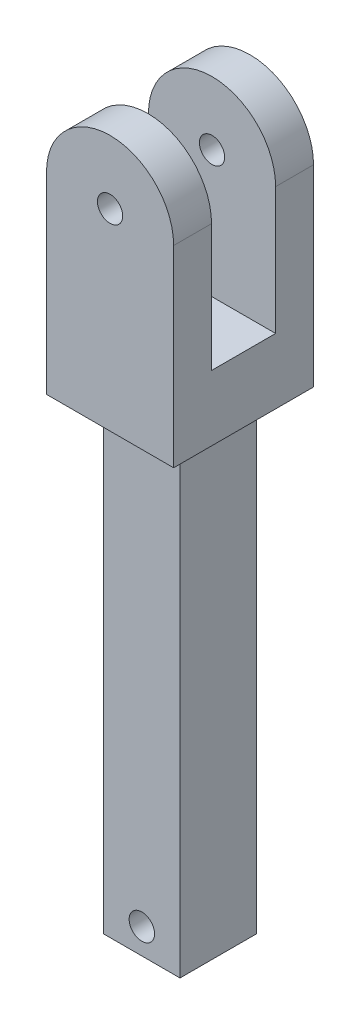
ISO-10303-21;
HEADER;
FILE_DESCRIPTION(('STEP AP214'),'2;1');
FILE_NAME('part.step','',(''),(''),'','','');
FILE_SCHEMA(('AUTOMOTIVE_DESIGN { 1 0 10303 214 1 1 1 1 }'));
ENDSEC;
DATA;
#1=APPLICATION_CONTEXT('core data for automotive mechanical design processes');
#2=APPLICATION_PROTOCOL_DEFINITION('international standard','automotive_design',2000,#1);
#3=PRODUCT_CONTEXT('',#1,'mechanical');
#4=PRODUCT('Part','Part','',(#3));
#5=PRODUCT_RELATED_PRODUCT_CATEGORY('part','',(#4));
#6=PRODUCT_DEFINITION_FORMATION('','',#4);
#7=PRODUCT_DEFINITION_CONTEXT('part definition',#1,'design');
#8=PRODUCT_DEFINITION('design','',#6,#7);
#9=PRODUCT_DEFINITION_SHAPE('','',#8);
#10=(LENGTH_UNIT() NAMED_UNIT(*) SI_UNIT(.MILLI.,.METRE.));
#11=(NAMED_UNIT(*) PLANE_ANGLE_UNIT() SI_UNIT($,.RADIAN.));
#12=(NAMED_UNIT(*) SI_UNIT($,.STERADIAN.) SOLID_ANGLE_UNIT());
#13=UNCERTAINTY_MEASURE_WITH_UNIT(LENGTH_MEASURE(1.E-05),#10,'distance_accuracy_value','');
#14=(GEOMETRIC_REPRESENTATION_CONTEXT(3) GLOBAL_UNCERTAINTY_ASSIGNED_CONTEXT((#13)) GLOBAL_UNIT_ASSIGNED_CONTEXT((#10,
#11,#12)) REPRESENTATION_CONTEXT('',''));
#15=CARTESIAN_POINT('',(0.,0.,0.));
#16=DIRECTION('',(0.,0.,1.));
#17=DIRECTION('',(1.,0.,0.));
#18=AXIS2_PLACEMENT_3D('',#15,#16,#17);
#19=CARTESIAN_POINT('',(10.,0.,12.));
#20=DIRECTION('',(-1.,0.,0.));
#21=DIRECTION('',(0.,-1.,0.));
#22=AXIS2_PLACEMENT_3D('',#19,#20,#21);
#23=PLANE('',#22);
#24=DIRECTION('',(0.,0.,-1.));
#25=VECTOR('',#24,1.);
#26=CARTESIAN_POINT('',(10.,-20.,0.));
#27=LINE('',#26,#25);
#28=CARTESIAN_POINT('',(10.,-20.,11.04));
#29=VERTEX_POINT('',#28);
#30=CARTESIAN_POINT('',(10.,-20.,0.959999999999997));
#31=VERTEX_POINT('',#30);
#32=EDGE_CURVE('E225',#29,#31,#27,.T.);
#33=ORIENTED_EDGE('',*,*,#32,.F.);
#34=DIRECTION('',(0.,1.,0.));
#35=VECTOR('',#34,1.);
#36=CARTESIAN_POINT('',(10.,0.,11.04));
#37=LINE('',#36,#35);
#38=CARTESIAN_POINT('',(10.,0.,11.04));
#39=VERTEX_POINT('',#38);
#40=EDGE_CURVE('E175',#29,#39,#37,.T.);
#41=ORIENTED_EDGE('',*,*,#40,.T.);
#42=DIRECTION('',(0.,0.,-1.));
#43=VECTOR('',#42,1.);
#44=CARTESIAN_POINT('',(10.,0.,12.));
#45=LINE('',#44,#43);
#46=CARTESIAN_POINT('',(10.,0.,17.));
#47=VERTEX_POINT('',#46);
#48=EDGE_CURVE('E11',#47,#39,#45,.T.);
#49=ORIENTED_EDGE('',*,*,#48,.F.);
#50=DIRECTION('',(0.,1.,0.));
#51=VECTOR('',#50,1.);
#52=CARTESIAN_POINT('',(10.,0.,17.));
#53=LINE('',#52,#51);
#54=CARTESIAN_POINT('',(10.,-30.2764175480678,17.));
#55=VERTEX_POINT('',#54);
#56=EDGE_CURVE('E222',#55,#47,#53,.T.);
#57=ORIENTED_EDGE('',*,*,#56,.F.);
#58=DIRECTION('',(0.,0.,-1.));
#59=VECTOR('',#58,1.);
#60=CARTESIAN_POINT('',(10.,-30.2764175480678,12.));
#61=LINE('',#60,#59);
#62=CARTESIAN_POINT('',(10.,-30.2764175480678,-5.));
#63=VERTEX_POINT('',#62);
#64=EDGE_CURVE('E228',#55,#63,#61,.T.);
#65=ORIENTED_EDGE('',*,*,#64,.T.);
#66=DIRECTION('',(0.,-1.,0.));
#67=VECTOR('',#66,1.);
#68=CARTESIAN_POINT('',(10.,0.,-5.));
#69=LINE('',#68,#67);
#70=CARTESIAN_POINT('',(10.,0.,-5.));
#71=VERTEX_POINT('',#70);
#72=EDGE_CURVE('E201',#71,#63,#69,.T.);
#73=ORIENTED_EDGE('',*,*,#72,.F.);
#74=CARTESIAN_POINT('',(10.,0.,0.959999999999997));
#75=VERTEX_POINT('',#74);
#76=EDGE_CURVE('E52',#75,#71,#45,.T.);
#77=ORIENTED_EDGE('',*,*,#76,.F.);
#78=DIRECTION('',(0.,1.,0.));
#79=VECTOR('',#78,1.);
#80=CARTESIAN_POINT('',(10.,0.,0.959999999999997));
#81=LINE('',#80,#79);
#82=EDGE_CURVE('E173',#31,#75,#81,.T.);
#83=ORIENTED_EDGE('',*,*,#82,.F.);
#84=EDGE_LOOP('',(#33,#41,#49,#57,#65,#73,#77,#83));
#85=FACE_BOUND('',#84,.T.);
#86=ADVANCED_FACE('F43',(#85),#23,.F.);
#87=CARTESIAN_POINT('',(0.,0.,12.));
#88=DIRECTION('',(0.,0.,-1.));
#89=DIRECTION('',(-1.,0.,0.));
#90=AXIS2_PLACEMENT_3D('',#87,#88,#89);
#91=CYLINDRICAL_SURFACE('',#90,10.);
#92=CARTESIAN_POINT('',(0.,0.,0.959999999999997));
#93=DIRECTION('',(0.,0.,1.));
#94=DIRECTION('',(1.,0.,0.));
#95=AXIS2_PLACEMENT_3D('',#92,#93,#94);
#96=CIRCLE('',#95,10.);
#97=CARTESIAN_POINT('',(-10.,0.,0.959999999999997));
#98=VERTEX_POINT('',#97);
#99=EDGE_CURVE('E193',#75,#98,#96,.T.);
#100=ORIENTED_EDGE('',*,*,#99,.F.);
#101=ORIENTED_EDGE('',*,*,#76,.T.);
#102=CARTESIAN_POINT('',(0.,0.,-5.));
#103=DIRECTION('',(0.,0.,-1.));
#104=DIRECTION('',(-1.,0.,0.));
#105=AXIS2_PLACEMENT_3D('',#102,#103,#104);
#106=CIRCLE('',#105,10.);
#107=CARTESIAN_POINT('',(-10.,0.,-5.));
#108=VERTEX_POINT('',#107);
#109=EDGE_CURVE('E198',#108,#71,#106,.T.);
#110=ORIENTED_EDGE('',*,*,#109,.F.);
#111=DIRECTION('',(0.,0.,-1.));
#112=VECTOR('',#111,1.);
#113=CARTESIAN_POINT('',(-10.,0.,12.));
#114=LINE('',#113,#112);
#115=EDGE_CURVE('E233',#98,#108,#114,.T.);
#116=ORIENTED_EDGE('',*,*,#115,.F.);
#117=EDGE_LOOP('',(#100,#101,#110,#116));
#118=FACE_BOUND('',#117,.T.);
#119=ADVANCED_FACE('F260',(#118),#91,.T.);
#120=CARTESIAN_POINT('',(-10.,0.,12.));
#121=DIRECTION('',(1.,0.,0.));
#122=DIRECTION('',(0.,1.,0.));
#123=AXIS2_PLACEMENT_3D('',#120,#121,#122);
#124=PLANE('',#123);
#125=DIRECTION('',(0.,1.,0.));
#126=VECTOR('',#125,1.);
#127=CARTESIAN_POINT('',(-10.,0.,0.959999999999997));
#128=LINE('',#127,#126);
#129=CARTESIAN_POINT('',(-10.,-20.,0.959999999999997));
#130=VERTEX_POINT('',#129);
#131=EDGE_CURVE('E141',#130,#98,#128,.T.);
#132=ORIENTED_EDGE('',*,*,#131,.T.);
#133=ORIENTED_EDGE('',*,*,#115,.T.);
#134=DIRECTION('',(0.,1.,0.));
#135=VECTOR('',#134,1.);
#136=CARTESIAN_POINT('',(-10.,0.,-5.));
#137=LINE('',#136,#135);
#138=CARTESIAN_POINT('',(-10.,-30.2764175480678,-5.));
#139=VERTEX_POINT('',#138);
#140=EDGE_CURVE('E207',#139,#108,#137,.T.);
#141=ORIENTED_EDGE('',*,*,#140,.F.);
#142=DIRECTION('',(0.,0.,-1.));
#143=VECTOR('',#142,1.);
#144=CARTESIAN_POINT('',(-10.,-30.2764175480678,12.));
#145=LINE('',#144,#143);
#146=CARTESIAN_POINT('',(-10.,-30.2764175480678,17.));
#147=VERTEX_POINT('',#146);
#148=EDGE_CURVE('E231',#147,#139,#145,.T.);
#149=ORIENTED_EDGE('',*,*,#148,.F.);
#150=DIRECTION('',(0.,-1.,0.));
#151=VECTOR('',#150,1.);
#152=CARTESIAN_POINT('',(-10.,0.,17.));
#153=LINE('',#152,#151);
#154=CARTESIAN_POINT('',(-10.,0.,17.));
#155=VERTEX_POINT('',#154);
#156=EDGE_CURVE('E216',#155,#147,#153,.T.);
#157=ORIENTED_EDGE('',*,*,#156,.F.);
#158=CARTESIAN_POINT('',(-10.,0.,11.04));
#159=VERTEX_POINT('',#158);
#160=EDGE_CURVE('E234',#155,#159,#114,.T.);
#161=ORIENTED_EDGE('',*,*,#160,.T.);
#162=DIRECTION('',(0.,1.,0.));
#163=VECTOR('',#162,1.);
#164=CARTESIAN_POINT('',(-10.,0.,11.04));
#165=LINE('',#164,#163);
#166=CARTESIAN_POINT('',(-10.,-20.,11.04));
#167=VERTEX_POINT('',#166);
#168=EDGE_CURVE('E176',#167,#159,#165,.T.);
#169=ORIENTED_EDGE('',*,*,#168,.F.);
#170=DIRECTION('',(0.,0.,-1.));
#171=VECTOR('',#170,1.);
#172=CARTESIAN_POINT('',(-10.,-20.,0.));
#173=LINE('',#172,#171);
#174=EDGE_CURVE('E226',#167,#130,#173,.T.);
#175=ORIENTED_EDGE('',*,*,#174,.T.);
#176=EDGE_LOOP('',(#132,#133,#141,#149,#157,#161,#169,#175));
#177=FACE_BOUND('',#176,.T.);
#178=ADVANCED_FACE('F256',(#177),#124,.F.);
#179=CARTESIAN_POINT('',(0.,0.,12.));
#180=DIRECTION('',(0.,0.,-1.));
#181=DIRECTION('',(-1.,0.,0.));
#182=AXIS2_PLACEMENT_3D('',#179,#180,#181);
#183=CYLINDRICAL_SURFACE('',#182,1.985);
#184=CARTESIAN_POINT('',(0.,0.,-5.));
#185=DIRECTION('',(0.,0.,-1.));
#186=DIRECTION('',(-1.,0.,0.));
#187=AXIS2_PLACEMENT_3D('',#184,#185,#186);
#188=CIRCLE('',#187,1.985);
#189=CARTESIAN_POINT('',(-1.985,0.,-5.));
#190=VERTEX_POINT('',#189);
#191=EDGE_CURVE('E195',#190,#190,#188,.F.);
#192=ORIENTED_EDGE('',*,*,#191,.F.);
#193=EDGE_LOOP('',(#192));
#194=FACE_BOUND('',#193,.T.);
#195=CARTESIAN_POINT('',(0.,0.,0.959999999999997));
#196=DIRECTION('',(0.,0.,1.));
#197=DIRECTION('',(1.,0.,0.));
#198=AXIS2_PLACEMENT_3D('',#195,#196,#197);
#199=CIRCLE('',#198,1.985);
#200=CARTESIAN_POINT('',(1.985,0.,0.959999999999997));
#201=VERTEX_POINT('',#200);
#202=EDGE_CURVE('E192',#201,#201,#199,.T.);
#203=ORIENTED_EDGE('',*,*,#202,.T.);
#204=EDGE_LOOP('',(#203));
#205=FACE_BOUND('',#204,.T.);
#206=ADVANCED_FACE('F241',(#194,#205),#183,.F.);
#207=ORIENTED_EDGE('',*,*,#48,.T.);
#208=CARTESIAN_POINT('',(0.,0.,11.04));
#209=DIRECTION('',(0.,0.,1.));
#210=DIRECTION('',(1.,0.,0.));
#211=AXIS2_PLACEMENT_3D('',#208,#209,#210);
#212=CIRCLE('',#211,10.);
#213=EDGE_CURVE('E190',#39,#159,#212,.T.);
#214=ORIENTED_EDGE('',*,*,#213,.T.);
#215=ORIENTED_EDGE('',*,*,#160,.F.);
#216=CARTESIAN_POINT('',(0.,0.,17.));
#217=DIRECTION('',(0.,0.,1.));
#218=DIRECTION('',(1.,0.,0.));
#219=AXIS2_PLACEMENT_3D('',#216,#217,#218);
#220=CIRCLE('',#219,10.);
#221=EDGE_CURVE('E213',#47,#155,#220,.T.);
#222=ORIENTED_EDGE('',*,*,#221,.F.);
#223=EDGE_LOOP('',(#207,#214,#215,#222));
#224=FACE_BOUND('',#223,.T.);
#225=ADVANCED_FACE('F275',(#224),#91,.T.);
#226=CARTESIAN_POINT('',(0.,0.,11.04));
#227=DIRECTION('',(0.,0.,1.));
#228=DIRECTION('',(1.,0.,0.));
#229=AXIS2_PLACEMENT_3D('',#226,#227,#228);
#230=CIRCLE('',#229,1.985);
#231=CARTESIAN_POINT('',(1.985,0.,11.04));
#232=VERTEX_POINT('',#231);
#233=EDGE_CURVE('E187',#232,#232,#230,.T.);
#234=ORIENTED_EDGE('',*,*,#233,.F.);
#235=EDGE_LOOP('',(#234));
#236=FACE_BOUND('',#235,.T.);
#237=CARTESIAN_POINT('',(0.,0.,17.));
#238=DIRECTION('',(0.,0.,1.));
#239=DIRECTION('',(1.,0.,0.));
#240=AXIS2_PLACEMENT_3D('',#237,#238,#239);
#241=CIRCLE('',#240,1.985);
#242=CARTESIAN_POINT('',(1.985,0.,17.));
#243=VERTEX_POINT('',#242);
#244=EDGE_CURVE('E210',#243,#243,#241,.F.);
#245=ORIENTED_EDGE('',*,*,#244,.F.);
#246=EDGE_LOOP('',(#245));
#247=FACE_BOUND('',#246,.T.);
#248=ADVANCED_FACE('F45',(#236,#247),#183,.F.);
#249=CARTESIAN_POINT('',(0.,-30.2764175480678,12.));
#250=DIRECTION('',(0.,1.,0.));
#251=DIRECTION('',(0.,0.,1.));
#252=AXIS2_PLACEMENT_3D('',#249,#250,#251);
#253=PLANE('',#252);
#254=DIRECTION('',(1.,0.,0.));
#255=VECTOR('',#254,1.);
#256=CARTESIAN_POINT('',(0.,-30.2764175480678,0.));
#257=LINE('',#256,#255);
#258=CARTESIAN_POINT('',(-6.,-30.2764175480678,0.));
#259=VERTEX_POINT('',#258);
#260=CARTESIAN_POINT('',(6.,-30.2764175480678,0.));
#261=VERTEX_POINT('',#260);
#262=EDGE_CURVE('E165',#259,#261,#257,.T.);
#263=ORIENTED_EDGE('',*,*,#262,.F.);
#264=DIRECTION('',(0.,0.,1.));
#265=VECTOR('',#264,1.);
#266=CARTESIAN_POINT('',(-6.,-30.2764175480678,0.));
#267=LINE('',#266,#265);
#268=CARTESIAN_POINT('',(-6.,-30.2764175480678,12.));
#269=VERTEX_POINT('',#268);
#270=EDGE_CURVE('E60',#259,#269,#267,.T.);
#271=ORIENTED_EDGE('',*,*,#270,.T.);
#272=DIRECTION('',(1.,0.,0.));
#273=VECTOR('',#272,1.);
#274=CARTESIAN_POINT('',(0.,-30.2764175480678,12.));
#275=LINE('',#274,#273);
#276=CARTESIAN_POINT('',(6.,-30.2764175480678,12.));
#277=VERTEX_POINT('',#276);
#278=EDGE_CURVE('E65',#269,#277,#275,.T.);
#279=ORIENTED_EDGE('',*,*,#278,.T.);
#280=DIRECTION('',(0.,0.,1.));
#281=VECTOR('',#280,1.);
#282=CARTESIAN_POINT('',(6.,-30.2764175480678,0.));
#283=LINE('',#282,#281);
#284=EDGE_CURVE('E156',#261,#277,#283,.T.);
#285=ORIENTED_EDGE('',*,*,#284,.F.);
#286=EDGE_LOOP('',(#263,#271,#279,#285));
#287=FACE_BOUND('',#286,.T.);
#288=ORIENTED_EDGE('',*,*,#148,.T.);
#289=DIRECTION('',(-1.,0.,0.));
#290=VECTOR('',#289,1.);
#291=CARTESIAN_POINT('',(0.,-30.2764175480678,-5.));
#292=LINE('',#291,#290);
#293=EDGE_CURVE('E204',#63,#139,#292,.T.);
#294=ORIENTED_EDGE('',*,*,#293,.F.);
#295=ORIENTED_EDGE('',*,*,#64,.F.);
#296=DIRECTION('',(1.,0.,0.));
#297=VECTOR('',#296,1.);
#298=CARTESIAN_POINT('',(0.,-30.2764175480678,17.));
#299=LINE('',#298,#297);
#300=EDGE_CURVE('E219',#147,#55,#299,.T.);
#301=ORIENTED_EDGE('',*,*,#300,.F.);
#302=EDGE_LOOP('',(#288,#294,#295,#301));
#303=FACE_BOUND('',#302,.T.);
#304=ADVANCED_FACE('F272',(#287,#303),#253,.F.);
#305=CARTESIAN_POINT('',(-10.,-20.,0.));
#306=DIRECTION('',(0.,-1.,0.));
#307=DIRECTION('',(0.,0.,-1.));
#308=AXIS2_PLACEMENT_3D('',#305,#306,#307);
#309=PLANE('',#308);
#310=ORIENTED_EDGE('',*,*,#32,.T.);
#311=DIRECTION('',(-1.,0.,0.));
#312=VECTOR('',#311,1.);
#313=CARTESIAN_POINT('',(10.,-20.,0.959999999999997));
#314=LINE('',#313,#312);
#315=EDGE_CURVE('E179',#31,#130,#314,.T.);
#316=ORIENTED_EDGE('',*,*,#315,.T.);
#317=ORIENTED_EDGE('',*,*,#174,.F.);
#318=DIRECTION('',(-1.,0.,0.));
#319=VECTOR('',#318,1.);
#320=CARTESIAN_POINT('',(10.,-20.,11.04));
#321=LINE('',#320,#319);
#322=EDGE_CURVE('E184',#29,#167,#321,.T.);
#323=ORIENTED_EDGE('',*,*,#322,.F.);
#324=EDGE_LOOP('',(#310,#316,#317,#323));
#325=FACE_BOUND('',#324,.T.);
#326=ADVANCED_FACE('F280',(#325),#309,.F.);
#327=CARTESIAN_POINT('',(0.,0.,17.));
#328=DIRECTION('',(0.,0.,1.));
#329=DIRECTION('',(1.,0.,0.));
#330=AXIS2_PLACEMENT_3D('',#327,#328,#329);
#331=PLANE('',#330);
#332=ORIENTED_EDGE('',*,*,#244,.T.);
#333=EDGE_LOOP('',(#332));
#334=FACE_BOUND('',#333,.T.);
#335=ORIENTED_EDGE('',*,*,#221,.T.);
#336=ORIENTED_EDGE('',*,*,#156,.T.);
#337=ORIENTED_EDGE('',*,*,#300,.T.);
#338=ORIENTED_EDGE('',*,*,#56,.T.);
#339=EDGE_LOOP('',(#335,#336,#337,#338));
#340=FACE_BOUND('',#339,.T.);
#341=ADVANCED_FACE('F269',(#334,#340),#331,.T.);
#342=CARTESIAN_POINT('',(0.,0.,-5.));
#343=DIRECTION('',(0.,0.,-1.));
#344=DIRECTION('',(-1.,0.,0.));
#345=AXIS2_PLACEMENT_3D('',#342,#343,#344);
#346=PLANE('',#345);
#347=ORIENTED_EDGE('',*,*,#191,.T.);
#348=EDGE_LOOP('',(#347));
#349=FACE_BOUND('',#348,.T.);
#350=ORIENTED_EDGE('',*,*,#109,.T.);
#351=ORIENTED_EDGE('',*,*,#72,.T.);
#352=ORIENTED_EDGE('',*,*,#293,.T.);
#353=ORIENTED_EDGE('',*,*,#140,.T.);
#354=EDGE_LOOP('',(#350,#351,#352,#353));
#355=FACE_BOUND('',#354,.T.);
#356=ADVANCED_FACE('F263',(#349,#355),#346,.T.);
#357=CARTESIAN_POINT('',(10.,0.,11.04));
#358=DIRECTION('',(0.,0.,1.));
#359=DIRECTION('',(1.,0.,0.));
#360=AXIS2_PLACEMENT_3D('',#357,#358,#359);
#361=PLANE('',#360);
#362=ORIENTED_EDGE('',*,*,#233,.T.);
#363=EDGE_LOOP('',(#362));
#364=FACE_BOUND('',#363,.T.);
#365=ORIENTED_EDGE('',*,*,#40,.F.);
#366=ORIENTED_EDGE('',*,*,#322,.T.);
#367=ORIENTED_EDGE('',*,*,#168,.T.);
#368=ORIENTED_EDGE('',*,*,#213,.F.);
#369=EDGE_LOOP('',(#365,#366,#367,#368));
#370=FACE_BOUND('',#369,.T.);
#371=ADVANCED_FACE('F246',(#364,#370),#361,.F.);
#372=CARTESIAN_POINT('',(10.,0.,0.959999999999997));
#373=DIRECTION('',(0.,0.,1.));
#374=DIRECTION('',(1.,0.,0.));
#375=AXIS2_PLACEMENT_3D('',#372,#373,#374);
#376=PLANE('',#375);
#377=ORIENTED_EDGE('',*,*,#202,.F.);
#378=EDGE_LOOP('',(#377));
#379=FACE_BOUND('',#378,.T.);
#380=ORIENTED_EDGE('',*,*,#99,.T.);
#381=ORIENTED_EDGE('',*,*,#131,.F.);
#382=ORIENTED_EDGE('',*,*,#315,.F.);
#383=ORIENTED_EDGE('',*,*,#82,.T.);
#384=EDGE_LOOP('',(#380,#381,#382,#383));
#385=FACE_BOUND('',#384,.T.);
#386=ADVANCED_FACE('F243',(#379,#385),#376,.T.);
#387=CARTESIAN_POINT('',(-6.,-104.276417548068,0.));
#388=DIRECTION('',(-1.,0.,0.));
#389=DIRECTION('',(0.,0.,1.));
#390=AXIS2_PLACEMENT_3D('',#387,#388,#389);
#391=PLANE('',#390);
#392=ORIENTED_EDGE('',*,*,#270,.F.);
#393=DIRECTION('',(0.,1.,0.));
#394=VECTOR('',#393,1.);
#395=CARTESIAN_POINT('',(-6.,-104.276417548068,0.));
#396=LINE('',#395,#394);
#397=CARTESIAN_POINT('',(-6.,-104.276417548068,0.));
#398=VERTEX_POINT('',#397);
#399=EDGE_CURVE('E133',#398,#259,#396,.T.);
#400=ORIENTED_EDGE('',*,*,#399,.F.);
#401=DIRECTION('',(0.,0.,1.));
#402=VECTOR('',#401,1.);
#403=CARTESIAN_POINT('',(-6.,-104.276417548068,0.));
#404=LINE('',#403,#402);
#405=CARTESIAN_POINT('',(-6.,-104.276417548068,12.));
#406=VERTEX_POINT('',#405);
#407=EDGE_CURVE('E137',#398,#406,#404,.T.);
#408=ORIENTED_EDGE('',*,*,#407,.T.);
#409=DIRECTION('',(0.,1.,0.));
#410=VECTOR('',#409,1.);
#411=CARTESIAN_POINT('',(-6.,-104.276417548068,12.));
#412=LINE('',#411,#410);
#413=EDGE_CURVE('E163',#406,#269,#412,.T.);
#414=ORIENTED_EDGE('',*,*,#413,.T.);
#415=EDGE_LOOP('',(#392,#400,#408,#414));
#416=FACE_BOUND('',#415,.T.);
#417=ADVANCED_FACE('F135',(#416),#391,.T.);
#418=CARTESIAN_POINT('',(0.,-104.276417548068,0.));
#419=DIRECTION('',(0.,0.,1.));
#420=DIRECTION('',(1.,0.,0.));
#421=AXIS2_PLACEMENT_3D('',#418,#419,#420);
#422=PLANE('',#421);
#423=CARTESIAN_POINT('',(0.,-100.276417548068,0.));
#424=DIRECTION('',(0.,0.,-1.));
#425=DIRECTION('',(-1.,0.,0.));
#426=AXIS2_PLACEMENT_3D('',#423,#424,#425);
#427=CIRCLE('',#426,2.);
#428=CARTESIAN_POINT('',(-2.,-100.276417548068,0.));
#429=VERTEX_POINT('',#428);
#430=EDGE_CURVE('E159',#429,#429,#427,.T.);
#431=ORIENTED_EDGE('',*,*,#430,.F.);
#432=EDGE_LOOP('',(#431));
#433=FACE_BOUND('',#432,.T.);
#434=ORIENTED_EDGE('',*,*,#262,.T.);
#435=DIRECTION('',(0.,1.,0.));
#436=VECTOR('',#435,1.);
#437=CARTESIAN_POINT('',(6.,-104.276417548068,0.));
#438=LINE('',#437,#436);
#439=CARTESIAN_POINT('',(6.,-104.276417548068,0.));
#440=VERTEX_POINT('',#439);
#441=EDGE_CURVE('E142',#440,#261,#438,.T.);
#442=ORIENTED_EDGE('',*,*,#441,.F.);
#443=DIRECTION('',(1.,0.,0.));
#444=VECTOR('',#443,1.);
#445=CARTESIAN_POINT('',(0.,-104.276417548068,0.));
#446=LINE('',#445,#444);
#447=EDGE_CURVE('E145',#398,#440,#446,.T.);
#448=ORIENTED_EDGE('',*,*,#447,.F.);
#449=ORIENTED_EDGE('',*,*,#399,.T.);
#450=EDGE_LOOP('',(#434,#442,#448,#449));
#451=FACE_BOUND('',#450,.T.);
#452=ADVANCED_FACE('F146',(#433,#451),#422,.F.);
#453=CARTESIAN_POINT('',(6.,-104.276417548068,0.));
#454=DIRECTION('',(-1.,0.,0.));
#455=DIRECTION('',(0.,0.,1.));
#456=AXIS2_PLACEMENT_3D('',#453,#454,#455);
#457=PLANE('',#456);
#458=ORIENTED_EDGE('',*,*,#284,.T.);
#459=DIRECTION('',(0.,1.,0.));
#460=VECTOR('',#459,1.);
#461=CARTESIAN_POINT('',(6.,-104.276417548068,12.));
#462=LINE('',#461,#460);
#463=CARTESIAN_POINT('',(6.,-104.276417548068,12.));
#464=VERTEX_POINT('',#463);
#465=EDGE_CURVE('E170',#464,#277,#462,.T.);
#466=ORIENTED_EDGE('',*,*,#465,.F.);
#467=DIRECTION('',(0.,0.,1.));
#468=VECTOR('',#467,1.);
#469=CARTESIAN_POINT('',(6.,-104.276417548068,0.));
#470=LINE('',#469,#468);
#471=EDGE_CURVE('E150',#440,#464,#470,.T.);
#472=ORIENTED_EDGE('',*,*,#471,.F.);
#473=ORIENTED_EDGE('',*,*,#441,.T.);
#474=EDGE_LOOP('',(#458,#466,#472,#473));
#475=FACE_BOUND('',#474,.T.);
#476=ADVANCED_FACE('F325',(#475),#457,.F.);
#477=CARTESIAN_POINT('',(0.,-104.276417548068,12.));
#478=DIRECTION('',(0.,0.,1.));
#479=DIRECTION('',(1.,0.,0.));
#480=AXIS2_PLACEMENT_3D('',#477,#478,#479);
#481=PLANE('',#480);
#482=CARTESIAN_POINT('',(0.,-100.276417548068,12.));
#483=DIRECTION('',(0.,0.,1.));
#484=DIRECTION('',(1.,0.,0.));
#485=AXIS2_PLACEMENT_3D('',#482,#483,#484);
#486=CIRCLE('',#485,2.);
#487=CARTESIAN_POINT('',(2.,-100.276417548068,12.));
#488=VERTEX_POINT('',#487);
#489=EDGE_CURVE('E47',#488,#488,#486,.T.);
#490=ORIENTED_EDGE('',*,*,#489,.F.);
#491=EDGE_LOOP('',(#490));
#492=FACE_BOUND('',#491,.T.);
#493=ORIENTED_EDGE('',*,*,#278,.F.);
#494=ORIENTED_EDGE('',*,*,#413,.F.);
#495=DIRECTION('',(1.,0.,0.));
#496=VECTOR('',#495,1.);
#497=CARTESIAN_POINT('',(0.,-104.276417548068,12.));
#498=LINE('',#497,#496);
#499=EDGE_CURVE('E154',#406,#464,#498,.T.);
#500=ORIENTED_EDGE('',*,*,#499,.T.);
#501=ORIENTED_EDGE('',*,*,#465,.T.);
#502=EDGE_LOOP('',(#493,#494,#500,#501));
#503=FACE_BOUND('',#502,.T.);
#504=ADVANCED_FACE('F329',(#492,#503),#481,.T.);
#505=CARTESIAN_POINT('',(0.,-104.276417548068,0.));
#506=DIRECTION('',(0.,-1.,0.));
#507=DIRECTION('',(0.,0.,-1.));
#508=AXIS2_PLACEMENT_3D('',#505,#506,#507);
#509=PLANE('',#508);
#510=ORIENTED_EDGE('',*,*,#407,.F.);
#511=ORIENTED_EDGE('',*,*,#447,.T.);
#512=ORIENTED_EDGE('',*,*,#471,.T.);
#513=ORIENTED_EDGE('',*,*,#499,.F.);
#514=EDGE_LOOP('',(#510,#511,#512,#513));
#515=FACE_BOUND('',#514,.T.);
#516=ADVANCED_FACE('F152',(#515),#509,.T.);
#517=CARTESIAN_POINT('',(0.,-100.276417548068,17.));
#518=DIRECTION('',(0.,0.,-1.));
#519=DIRECTION('',(-1.,0.,0.));
#520=AXIS2_PLACEMENT_3D('',#517,#518,#519);
#521=CYLINDRICAL_SURFACE('',#520,2.);
#522=ORIENTED_EDGE('',*,*,#489,.T.);
#523=EDGE_LOOP('',(#522));
#524=FACE_BOUND('',#523,.T.);
#525=ORIENTED_EDGE('',*,*,#430,.T.);
#526=EDGE_LOOP('',(#525));
#527=FACE_BOUND('',#526,.T.);
#528=ADVANCED_FACE('F336',(#524,#527),#521,.F.);
#529=CLOSED_SHELL('',(#86,#119,#178,#206,#225,#248,#304,#326,#341,#356,#371,#386,#417,#452,#476,
#504,#516,#528));
#530=MANIFOLD_SOLID_BREP('B2',#529);
#531=ADVANCED_BREP_SHAPE_REPRESENTATION('',(#18,#530),#14);
#532=SHAPE_DEFINITION_REPRESENTATION(#9,#531);
ENDSEC;
END-ISO-10303-21;
